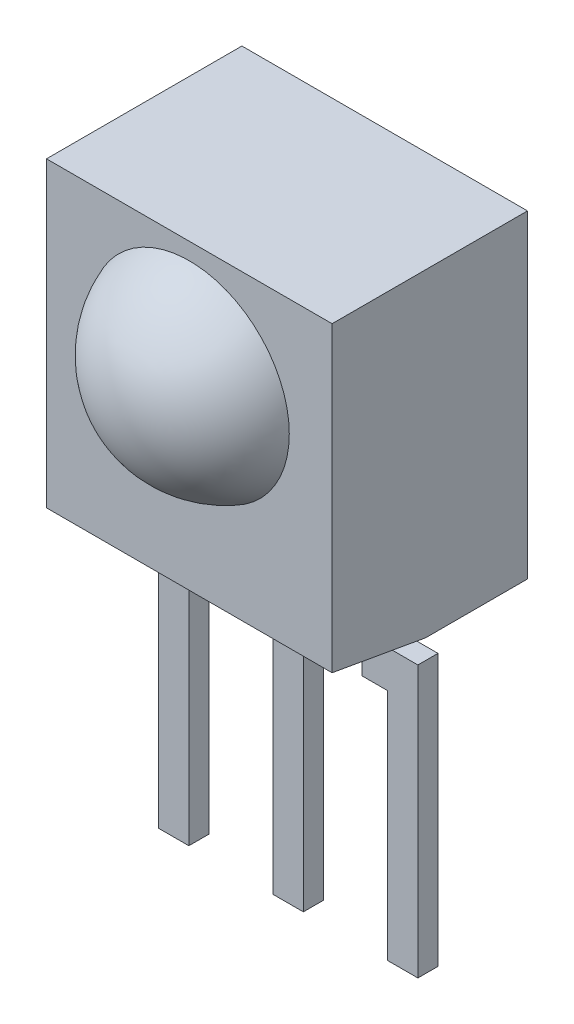
ISO-10303-21;
HEADER;
FILE_DESCRIPTION(('STEP AP214'),'2;1');
FILE_NAME('part.step','',(''),(''),'','','');
FILE_SCHEMA(('AUTOMOTIVE_DESIGN { 1 0 10303 214 1 1 1 1 }'));
ENDSEC;
DATA;
#1=APPLICATION_CONTEXT('core data for automotive mechanical design processes');
#2=APPLICATION_PROTOCOL_DEFINITION('international standard','automotive_design',2000,#1);
#3=PRODUCT_CONTEXT('',#1,'mechanical');
#4=PRODUCT('Part','Part','',(#3));
#5=PRODUCT_RELATED_PRODUCT_CATEGORY('part','',(#4));
#6=PRODUCT_DEFINITION_FORMATION('','',#4);
#7=PRODUCT_DEFINITION_CONTEXT('part definition',#1,'design');
#8=PRODUCT_DEFINITION('design','',#6,#7);
#9=PRODUCT_DEFINITION_SHAPE('','',#8);
#10=(LENGTH_UNIT() NAMED_UNIT(*) SI_UNIT(.MILLI.,.METRE.));
#11=(NAMED_UNIT(*) PLANE_ANGLE_UNIT() SI_UNIT($,.RADIAN.));
#12=(NAMED_UNIT(*) SI_UNIT($,.STERADIAN.) SOLID_ANGLE_UNIT());
#13=UNCERTAINTY_MEASURE_WITH_UNIT(LENGTH_MEASURE(1.E-05),#10,'distance_accuracy_value','');
#14=(GEOMETRIC_REPRESENTATION_CONTEXT(3) GLOBAL_UNCERTAINTY_ASSIGNED_CONTEXT((#13)) GLOBAL_UNIT_ASSIGNED_CONTEXT((#10,
#11,#12)) REPRESENTATION_CONTEXT('',''));
#15=CARTESIAN_POINT('',(0.,0.,0.));
#16=DIRECTION('',(0.,0.,1.));
#17=DIRECTION('',(1.,0.,0.));
#18=AXIS2_PLACEMENT_3D('',#15,#16,#17);
#19=CARTESIAN_POINT('',(-2.225,-4.91,1.635));
#20=DIRECTION('',(1.,0.,0.));
#21=DIRECTION('',(0.,1.,0.));
#22=AXIS2_PLACEMENT_3D('',#19,#20,#21);
#23=PLANE('',#22);
#24=DIRECTION('',(0.,0.,-1.));
#25=VECTOR('',#24,1.);
#26=CARTESIAN_POINT('',(-2.225,-4.11,1.635));
#27=LINE('',#26,#25);
#28=CARTESIAN_POINT('',(-2.225,-4.11,2.065));
#29=VERTEX_POINT('',#28);
#30=CARTESIAN_POINT('',(-2.225,-4.11,1.635));
#31=VERTEX_POINT('',#30);
#32=EDGE_CURVE('E282',#29,#31,#27,.T.);
#33=ORIENTED_EDGE('',*,*,#32,.F.);
#34=DIRECTION('',(0.,1.,0.));
#35=VECTOR('',#34,1.);
#36=CARTESIAN_POINT('',(-2.225,-4.91,2.065));
#37=LINE('',#36,#35);
#38=CARTESIAN_POINT('',(-2.225,-3.41,2.065));
#39=VERTEX_POINT('',#38);
#40=EDGE_CURVE('E304',#29,#39,#37,.T.);
#41=ORIENTED_EDGE('',*,*,#40,.T.);
#42=DIRECTION('',(0.,0.,-1.));
#43=VECTOR('',#42,1.);
#44=CARTESIAN_POINT('',(-2.225,-3.41,1.635));
#45=LINE('',#44,#43);
#46=CARTESIAN_POINT('',(-2.225,-3.41,1.635));
#47=VERTEX_POINT('',#46);
#48=EDGE_CURVE('E320',#39,#47,#45,.T.);
#49=ORIENTED_EDGE('',*,*,#48,.T.);
#50=DIRECTION('',(0.,1.,0.));
#51=VECTOR('',#50,1.);
#52=CARTESIAN_POINT('',(-2.225,-4.91,1.635));
#53=LINE('',#52,#51);
#54=EDGE_CURVE('E318',#31,#47,#53,.T.);
#55=ORIENTED_EDGE('',*,*,#54,.F.);
#56=EDGE_LOOP('',(#33,#41,#49,#55));
#57=FACE_BOUND('',#56,.T.);
#58=ADVANCED_FACE('F38',(#57),#23,.F.);
#59=CARTESIAN_POINT('',(3.055,-3.41,4.18));
#60=DIRECTION('',(0.,1.,0.));
#61=DIRECTION('',(-1.,0.,0.));
#62=AXIS2_PLACEMENT_3D('',#59,#60,#61);
#63=PLANE('',#62);
#64=DIRECTION('',(0.,0.,-1.));
#65=VECTOR('',#64,1.);
#66=CARTESIAN_POINT('',(1.575,-3.41,1.635));
#67=LINE('',#66,#65);
#68=CARTESIAN_POINT('',(1.575,-3.41,2.065));
#69=VERTEX_POINT('',#68);
#70=CARTESIAN_POINT('',(1.575,-3.41,1.635));
#71=VERTEX_POINT('',#70);
#72=EDGE_CURVE('E347',#69,#71,#67,.T.);
#73=ORIENTED_EDGE('',*,*,#72,.F.);
#74=DIRECTION('',(-1.,0.,0.));
#75=VECTOR('',#74,1.);
#76=CARTESIAN_POINT('',(2.225,-3.41,2.065));
#77=LINE('',#76,#75);
#78=CARTESIAN_POINT('',(2.225,-3.41,2.065));
#79=VERTEX_POINT('',#78);
#80=EDGE_CURVE('E323',#79,#69,#77,.T.);
#81=ORIENTED_EDGE('',*,*,#80,.F.);
#82=DIRECTION('',(0.,0.,1.));
#83=VECTOR('',#82,1.);
#84=CARTESIAN_POINT('',(2.225,-3.41,1.635));
#85=LINE('',#84,#83);
#86=CARTESIAN_POINT('',(2.225,-3.41,1.635));
#87=VERTEX_POINT('',#86);
#88=EDGE_CURVE('E336',#87,#79,#85,.T.);
#89=ORIENTED_EDGE('',*,*,#88,.F.);
#90=DIRECTION('',(1.,0.,0.));
#91=VECTOR('',#90,1.);
#92=CARTESIAN_POINT('',(2.225,-3.41,1.635));
#93=LINE('',#92,#91);
#94=EDGE_CURVE('E341',#71,#87,#93,.T.);
#95=ORIENTED_EDGE('',*,*,#94,.F.);
#96=EDGE_LOOP('',(#73,#81,#89,#95));
#97=FACE_BOUND('',#96,.T.);
#98=DIRECTION('',(0.,0.,-1.));
#99=VECTOR('',#98,1.);
#100=CARTESIAN_POINT('',(3.055,-3.41,4.18));
#101=LINE('',#100,#99);
#102=CARTESIAN_POINT('',(3.055,-3.41,2.17999999999996));
#103=VERTEX_POINT('',#102);
#104=CARTESIAN_POINT('',(3.055,-3.41,0.));
#105=VERTEX_POINT('',#104);
#106=EDGE_CURVE('E397',#103,#105,#101,.T.);
#107=ORIENTED_EDGE('',*,*,#106,.F.);
#108=DIRECTION('',(-1.,0.,0.));
#109=VECTOR('',#108,1.);
#110=CARTESIAN_POINT('',(-3.055,-3.41,2.17999999999996));
#111=LINE('',#110,#109);
#112=CARTESIAN_POINT('',(-3.055,-3.41,2.17999999999996));
#113=VERTEX_POINT('',#112);
#114=EDGE_CURVE('E47',#103,#113,#111,.T.);
#115=ORIENTED_EDGE('',*,*,#114,.T.);
#116=DIRECTION('',(0.,0.,-1.));
#117=VECTOR('',#116,1.);
#118=CARTESIAN_POINT('',(-3.055,-3.41,4.18));
#119=LINE('',#118,#117);
#120=CARTESIAN_POINT('',(-3.055,-3.41,0.));
#121=VERTEX_POINT('',#120);
#122=EDGE_CURVE('E399',#113,#121,#119,.T.);
#123=ORIENTED_EDGE('',*,*,#122,.T.);
#124=DIRECTION('',(1.,0.,0.));
#125=VECTOR('',#124,1.);
#126=CARTESIAN_POINT('',(3.055,-3.41,0.));
#127=LINE('',#126,#125);
#128=EDGE_CURVE('E386',#121,#105,#127,.T.);
#129=ORIENTED_EDGE('',*,*,#128,.T.);
#130=EDGE_LOOP('',(#107,#115,#123,#129));
#131=FACE_BOUND('',#130,.T.);
#132=DIRECTION('',(0.,0.,-1.));
#133=VECTOR('',#132,1.);
#134=CARTESIAN_POINT('',(-0.324999999999999,-3.41,1.635));
#135=LINE('',#134,#133);
#136=CARTESIAN_POINT('',(-0.324999999999999,-3.41,2.065));
#137=VERTEX_POINT('',#136);
#138=CARTESIAN_POINT('',(-0.324999999999998,-3.41,1.635));
#139=VERTEX_POINT('',#138);
#140=EDGE_CURVE('E350',#137,#139,#135,.T.);
#141=ORIENTED_EDGE('',*,*,#140,.F.);
#142=DIRECTION('',(-1.,0.,0.));
#143=VECTOR('',#142,1.);
#144=CARTESIAN_POINT('',(0.325000000000001,-3.41,2.065));
#145=LINE('',#144,#143);
#146=CARTESIAN_POINT('',(0.325000000000002,-3.41,2.065));
#147=VERTEX_POINT('',#146);
#148=EDGE_CURVE('E359',#147,#137,#145,.T.);
#149=ORIENTED_EDGE('',*,*,#148,.F.);
#150=DIRECTION('',(0.,0.,1.));
#151=VECTOR('',#150,1.);
#152=CARTESIAN_POINT('',(0.325000000000001,-3.41,1.635));
#153=LINE('',#152,#151);
#154=CARTESIAN_POINT('',(0.325000000000001,-3.41,1.635));
#155=VERTEX_POINT('',#154);
#156=EDGE_CURVE('E356',#155,#147,#153,.T.);
#157=ORIENTED_EDGE('',*,*,#156,.F.);
#158=DIRECTION('',(1.,0.,0.));
#159=VECTOR('',#158,1.);
#160=CARTESIAN_POINT('',(0.325000000000001,-3.41,1.635));
#161=LINE('',#160,#159);
#162=EDGE_CURVE('E353',#139,#155,#161,.T.);
#163=ORIENTED_EDGE('',*,*,#162,.F.);
#164=EDGE_LOOP('',(#141,#149,#157,#163));
#165=FACE_BOUND('',#164,.T.);
#166=ORIENTED_EDGE('',*,*,#48,.F.);
#167=DIRECTION('',(-1.,0.,0.));
#168=VECTOR('',#167,1.);
#169=CARTESIAN_POINT('',(-1.575,-3.41,2.065));
#170=LINE('',#169,#168);
#171=CARTESIAN_POINT('',(-1.575,-3.41,2.065));
#172=VERTEX_POINT('',#171);
#173=EDGE_CURVE('E295',#172,#39,#170,.T.);
#174=ORIENTED_EDGE('',*,*,#173,.F.);
#175=DIRECTION('',(0.,0.,1.));
#176=VECTOR('',#175,1.);
#177=CARTESIAN_POINT('',(-1.575,-3.41,1.635));
#178=LINE('',#177,#176);
#179=CARTESIAN_POINT('',(-1.575,-3.41,1.635));
#180=VERTEX_POINT('',#179);
#181=EDGE_CURVE('E309',#180,#172,#178,.T.);
#182=ORIENTED_EDGE('',*,*,#181,.F.);
#183=DIRECTION('',(1.,0.,0.));
#184=VECTOR('',#183,1.);
#185=CARTESIAN_POINT('',(-1.575,-3.41,1.635));
#186=LINE('',#185,#184);
#187=EDGE_CURVE('E315',#47,#180,#186,.T.);
#188=ORIENTED_EDGE('',*,*,#187,.F.);
#189=EDGE_LOOP('',(#166,#174,#182,#188));
#190=FACE_BOUND('',#189,.T.);
#191=ADVANCED_FACE('F431',(#97,#131,#165,#190),#63,.F.);
#192=CARTESIAN_POINT('',(-3.055,-3.41,4.18));
#193=DIRECTION('',(1.,0.,0.));
#194=DIRECTION('',(0.,0.,-1.));
#195=AXIS2_PLACEMENT_3D('',#192,#193,#194);
#196=PLANE('',#195);
#197=ORIENTED_EDGE('',*,*,#122,.F.);
#198=DIRECTION('',(0.,0.173648177666927,0.984807753012209));
#199=VECTOR('',#198,1.);
#200=CARTESIAN_POINT('',(-3.055,-3.05734603858307,4.18));
#201=LINE('',#200,#199);
#202=CARTESIAN_POINT('',(-3.055,-3.05734603858307,4.18));
#203=VERTEX_POINT('',#202);
#204=EDGE_CURVE('E11',#113,#203,#201,.T.);
#205=ORIENTED_EDGE('',*,*,#204,.T.);
#206=DIRECTION('',(0.,-1.,0.));
#207=VECTOR('',#206,1.);
#208=CARTESIAN_POINT('',(-3.055,-3.41,4.18));
#209=LINE('',#208,#207);
#210=CARTESIAN_POINT('',(-3.055,3.41,4.18));
#211=VERTEX_POINT('',#210);
#212=EDGE_CURVE('E375',#211,#203,#209,.T.);
#213=ORIENTED_EDGE('',*,*,#212,.F.);
#214=DIRECTION('',(0.,0.,-1.));
#215=VECTOR('',#214,1.);
#216=CARTESIAN_POINT('',(-3.055,3.41,4.18));
#217=LINE('',#216,#215);
#218=CARTESIAN_POINT('',(-3.055,3.41,0.));
#219=VERTEX_POINT('',#218);
#220=EDGE_CURVE('E383',#211,#219,#217,.T.);
#221=ORIENTED_EDGE('',*,*,#220,.T.);
#222=DIRECTION('',(0.,-1.,0.));
#223=VECTOR('',#222,1.);
#224=CARTESIAN_POINT('',(-3.055,-3.41,0.));
#225=LINE('',#224,#223);
#226=EDGE_CURVE('E374',#219,#121,#225,.T.);
#227=ORIENTED_EDGE('',*,*,#226,.T.);
#228=EDGE_LOOP('',(#197,#205,#213,#221,#227));
#229=FACE_BOUND('',#228,.T.);
#230=ADVANCED_FACE('F423',(#229),#196,.F.);
#231=CARTESIAN_POINT('',(3.055,-3.41,4.18));
#232=DIRECTION('',(-1.,0.,0.));
#233=DIRECTION('',(0.,0.,1.));
#234=AXIS2_PLACEMENT_3D('',#231,#232,#233);
#235=PLANE('',#234);
#236=DIRECTION('',(0.,1.,0.));
#237=VECTOR('',#236,1.);
#238=CARTESIAN_POINT('',(3.055,-3.41,4.18));
#239=LINE('',#238,#237);
#240=CARTESIAN_POINT('',(3.055,-3.05734603858307,4.18));
#241=VERTEX_POINT('',#240);
#242=CARTESIAN_POINT('',(3.055,3.41,4.18));
#243=VERTEX_POINT('',#242);
#244=EDGE_CURVE('E378',#241,#243,#239,.T.);
#245=ORIENTED_EDGE('',*,*,#244,.F.);
#246=DIRECTION('',(0.,-0.173648177666927,-0.984807753012209));
#247=VECTOR('',#246,1.);
#248=CARTESIAN_POINT('',(3.055,-3.05734603858307,4.18));
#249=LINE('',#248,#247);
#250=EDGE_CURVE('E61',#241,#103,#249,.T.);
#251=ORIENTED_EDGE('',*,*,#250,.T.);
#252=ORIENTED_EDGE('',*,*,#106,.T.);
#253=DIRECTION('',(0.,1.,0.));
#254=VECTOR('',#253,1.);
#255=CARTESIAN_POINT('',(3.055,-3.41,0.));
#256=LINE('',#255,#254);
#257=CARTESIAN_POINT('',(3.055,3.41,0.));
#258=VERTEX_POINT('',#257);
#259=EDGE_CURVE('E389',#105,#258,#256,.T.);
#260=ORIENTED_EDGE('',*,*,#259,.T.);
#261=DIRECTION('',(0.,0.,-1.));
#262=VECTOR('',#261,1.);
#263=CARTESIAN_POINT('',(3.055,3.41,4.18));
#264=LINE('',#263,#262);
#265=EDGE_CURVE('E394',#243,#258,#264,.T.);
#266=ORIENTED_EDGE('',*,*,#265,.F.);
#267=EDGE_LOOP('',(#245,#251,#252,#260,#266));
#268=FACE_BOUND('',#267,.T.);
#269=ADVANCED_FACE('F414',(#268),#235,.F.);
#270=CARTESIAN_POINT('',(3.055,3.41,4.18));
#271=DIRECTION('',(0.,-1.,0.));
#272=DIRECTION('',(1.,0.,0.));
#273=AXIS2_PLACEMENT_3D('',#270,#271,#272);
#274=PLANE('',#273);
#275=DIRECTION('',(-1.,0.,0.));
#276=VECTOR('',#275,1.);
#277=CARTESIAN_POINT('',(3.055,3.41,0.));
#278=LINE('',#277,#276);
#279=EDGE_CURVE('E379',#258,#219,#278,.T.);
#280=ORIENTED_EDGE('',*,*,#279,.T.);
#281=ORIENTED_EDGE('',*,*,#220,.F.);
#282=DIRECTION('',(-1.,0.,0.));
#283=VECTOR('',#282,1.);
#284=CARTESIAN_POINT('',(3.055,3.41,4.18));
#285=LINE('',#284,#283);
#286=EDGE_CURVE('E381',#243,#211,#285,.T.);
#287=ORIENTED_EDGE('',*,*,#286,.F.);
#288=ORIENTED_EDGE('',*,*,#265,.T.);
#289=EDGE_LOOP('',(#280,#281,#287,#288));
#290=FACE_BOUND('',#289,.T.);
#291=ADVANCED_FACE('F420',(#290),#274,.F.);
#292=CARTESIAN_POINT('',(0.,0.,4.18));
#293=DIRECTION('',(0.,0.,1.));
#294=DIRECTION('',(1.,0.,0.));
#295=AXIS2_PLACEMENT_3D('',#292,#293,#294);
#296=PLANE('',#295);
#297=CARTESIAN_POINT('',(0.,0.91,4.18));
#298=DIRECTION('',(0.,0.,1.));
#299=DIRECTION('',(1.,0.,0.));
#300=AXIS2_PLACEMENT_3D('',#297,#298,#299);
#301=CIRCLE('',#300,2.13892496362074);
#302=CARTESIAN_POINT('',(2.13892496362074,0.91,4.18));
#303=VERTEX_POINT('',#302);
#304=EDGE_CURVE('E401',#303,#303,#301,.T.);
#305=ORIENTED_EDGE('',*,*,#304,.F.);
#306=EDGE_LOOP('',(#305));
#307=FACE_BOUND('',#306,.T.);
#308=ORIENTED_EDGE('',*,*,#212,.T.);
#309=DIRECTION('',(1.,0.,0.));
#310=VECTOR('',#309,1.);
#311=CARTESIAN_POINT('',(3.055,-3.05734603858307,4.18));
#312=LINE('',#311,#310);
#313=EDGE_CURVE('E404',#203,#241,#312,.T.);
#314=ORIENTED_EDGE('',*,*,#313,.T.);
#315=ORIENTED_EDGE('',*,*,#244,.T.);
#316=ORIENTED_EDGE('',*,*,#286,.T.);
#317=EDGE_LOOP('',(#308,#314,#315,#316));
#318=FACE_BOUND('',#317,.T.);
#319=ADVANCED_FACE('F409',(#307,#318),#296,.T.);
#320=CARTESIAN_POINT('',(0.,0.,0.));
#321=DIRECTION('',(0.,0.,1.));
#322=DIRECTION('',(1.,0.,0.));
#323=AXIS2_PLACEMENT_3D('',#320,#321,#322);
#324=PLANE('',#323);
#325=ORIENTED_EDGE('',*,*,#226,.F.);
#326=ORIENTED_EDGE('',*,*,#279,.F.);
#327=ORIENTED_EDGE('',*,*,#259,.F.);
#328=ORIENTED_EDGE('',*,*,#128,.F.);
#329=EDGE_LOOP('',(#325,#326,#327,#328));
#330=FACE_BOUND('',#329,.T.);
#331=ADVANCED_FACE('F481',(#330),#324,.F.);
#332=CARTESIAN_POINT('',(0.,0.91,3.405));
#333=DIRECTION('',(0.,1.,0.));
#334=DIRECTION('',(0.,0.,-1.));
#335=AXIS2_PLACEMENT_3D('',#332,#333,#334);
#336=SPHERICAL_SURFACE('',#335,2.275);
#337=CARTESIAN_POINT('',(0.,0.91,3.405));
#338=DIRECTION('',(0.,0.,1.));
#339=DIRECTION('',(1.,0.,0.));
#340=AXIS2_PLACEMENT_3D('',#337,#338,#339);
#341=SPHERICAL_SURFACE('',#340,2.275);
#342=ORIENTED_EDGE('',*,*,#304,.T.);
#343=EDGE_LOOP('',(#342));
#344=FACE_BOUND('',#343,.T.);
#345=ADVANCED_FACE('F477',(#344),#341,.T.);
#346=CARTESIAN_POINT('',(-0.324999999999998,-4.91,1.635));
#347=DIRECTION('',(1.,0.,0.));
#348=DIRECTION('',(0.,1.,0.));
#349=AXIS2_PLACEMENT_3D('',#346,#347,#348);
#350=PLANE('',#349);
#351=ORIENTED_EDGE('',*,*,#140,.T.);
#352=DIRECTION('',(0.,1.,0.));
#353=VECTOR('',#352,1.);
#354=CARTESIAN_POINT('',(-0.324999999999998,-4.91,1.635));
#355=LINE('',#354,#353);
#356=CARTESIAN_POINT('',(-0.324999999999999,-9.91,1.635));
#357=VERTEX_POINT('',#356);
#358=EDGE_CURVE('E371',#357,#139,#355,.T.);
#359=ORIENTED_EDGE('',*,*,#358,.F.);
#360=DIRECTION('',(0.,0.,-1.));
#361=VECTOR('',#360,1.);
#362=CARTESIAN_POINT('',(-0.324999999999999,-9.91,1.635));
#363=LINE('',#362,#361);
#364=CARTESIAN_POINT('',(-0.324999999999999,-9.91,2.065));
#365=VERTEX_POINT('',#364);
#366=EDGE_CURVE('E267',#365,#357,#363,.T.);
#367=ORIENTED_EDGE('',*,*,#366,.F.);
#368=DIRECTION('',(0.,1.,0.));
#369=VECTOR('',#368,1.);
#370=CARTESIAN_POINT('',(-0.324999999999998,-4.91,2.065));
#371=LINE('',#370,#369);
#372=EDGE_CURVE('E362',#365,#137,#371,.T.);
#373=ORIENTED_EDGE('',*,*,#372,.T.);
#374=EDGE_LOOP('',(#351,#359,#367,#373));
#375=FACE_BOUND('',#374,.T.);
#376=ADVANCED_FACE('F473',(#375),#350,.F.);
#377=CARTESIAN_POINT('',(0.325000000000002,-4.91,1.635));
#378=DIRECTION('',(0.,0.,1.));
#379=DIRECTION('',(1.,0.,0.));
#380=AXIS2_PLACEMENT_3D('',#377,#378,#379);
#381=PLANE('',#380);
#382=ORIENTED_EDGE('',*,*,#162,.T.);
#383=DIRECTION('',(0.,1.,0.));
#384=VECTOR('',#383,1.);
#385=CARTESIAN_POINT('',(0.325000000000002,-4.91,1.635));
#386=LINE('',#385,#384);
#387=CARTESIAN_POINT('',(0.325000000000002,-9.91,1.635));
#388=VERTEX_POINT('',#387);
#389=EDGE_CURVE('E368',#388,#155,#386,.T.);
#390=ORIENTED_EDGE('',*,*,#389,.F.);
#391=DIRECTION('',(1.,0.,0.));
#392=VECTOR('',#391,1.);
#393=CARTESIAN_POINT('',(0.325000000000002,-9.91,1.635));
#394=LINE('',#393,#392);
#395=EDGE_CURVE('E270',#357,#388,#394,.T.);
#396=ORIENTED_EDGE('',*,*,#395,.F.);
#397=ORIENTED_EDGE('',*,*,#358,.T.);
#398=EDGE_LOOP('',(#382,#390,#396,#397));
#399=FACE_BOUND('',#398,.T.);
#400=ADVANCED_FACE('F469',(#399),#381,.F.);
#401=CARTESIAN_POINT('',(0.325000000000002,-4.91,1.635));
#402=DIRECTION('',(-1.,0.,0.));
#403=DIRECTION('',(0.,-1.,0.));
#404=AXIS2_PLACEMENT_3D('',#401,#402,#403);
#405=PLANE('',#404);
#406=ORIENTED_EDGE('',*,*,#156,.T.);
#407=DIRECTION('',(0.,1.,0.));
#408=VECTOR('',#407,1.);
#409=CARTESIAN_POINT('',(0.325000000000002,-4.91,2.065));
#410=LINE('',#409,#408);
#411=CARTESIAN_POINT('',(0.325000000000002,-9.91,2.065));
#412=VERTEX_POINT('',#411);
#413=EDGE_CURVE('E365',#412,#147,#410,.T.);
#414=ORIENTED_EDGE('',*,*,#413,.F.);
#415=DIRECTION('',(0.,0.,1.));
#416=VECTOR('',#415,1.);
#417=CARTESIAN_POINT('',(0.325000000000002,-9.91,1.635));
#418=LINE('',#417,#416);
#419=EDGE_CURVE('E261',#388,#412,#418,.T.);
#420=ORIENTED_EDGE('',*,*,#419,.F.);
#421=ORIENTED_EDGE('',*,*,#389,.T.);
#422=EDGE_LOOP('',(#406,#414,#420,#421));
#423=FACE_BOUND('',#422,.T.);
#424=ADVANCED_FACE('F465',(#423),#405,.F.);
#425=CARTESIAN_POINT('',(0.325000000000002,-4.91,2.065));
#426=DIRECTION('',(0.,0.,-1.));
#427=DIRECTION('',(-1.,0.,0.));
#428=AXIS2_PLACEMENT_3D('',#425,#426,#427);
#429=PLANE('',#428);
#430=ORIENTED_EDGE('',*,*,#148,.T.);
#431=ORIENTED_EDGE('',*,*,#372,.F.);
#432=DIRECTION('',(-1.,0.,0.));
#433=VECTOR('',#432,1.);
#434=CARTESIAN_POINT('',(0.325000000000002,-9.91,2.065));
#435=LINE('',#434,#433);
#436=EDGE_CURVE('E264',#412,#365,#435,.T.);
#437=ORIENTED_EDGE('',*,*,#436,.F.);
#438=ORIENTED_EDGE('',*,*,#413,.T.);
#439=EDGE_LOOP('',(#430,#431,#437,#438));
#440=FACE_BOUND('',#439,.T.);
#441=ADVANCED_FACE('F461',(#440),#429,.F.);
#442=CARTESIAN_POINT('',(1.575,-4.91,1.635));
#443=DIRECTION('',(1.,0.,0.));
#444=DIRECTION('',(0.,1.,0.));
#445=AXIS2_PLACEMENT_3D('',#442,#443,#444);
#446=PLANE('',#445);
#447=ORIENTED_EDGE('',*,*,#72,.T.);
#448=DIRECTION('',(0.,1.,0.));
#449=VECTOR('',#448,1.);
#450=CARTESIAN_POINT('',(1.575,-4.91,1.635));
#451=LINE('',#450,#449);
#452=CARTESIAN_POINT('',(1.575,-4.91,1.635));
#453=VERTEX_POINT('',#452);
#454=EDGE_CURVE('E344',#453,#71,#451,.T.);
#455=ORIENTED_EDGE('',*,*,#454,.F.);
#456=DIRECTION('',(0.,0.,-1.));
#457=VECTOR('',#456,1.);
#458=CARTESIAN_POINT('',(1.575,-4.91,1.635));
#459=LINE('',#458,#457);
#460=CARTESIAN_POINT('',(1.575,-4.91,2.065));
#461=VERTEX_POINT('',#460);
#462=EDGE_CURVE('E325',#461,#453,#459,.T.);
#463=ORIENTED_EDGE('',*,*,#462,.F.);
#464=DIRECTION('',(0.,1.,0.));
#465=VECTOR('',#464,1.);
#466=CARTESIAN_POINT('',(1.575,-4.91,2.065));
#467=LINE('',#466,#465);
#468=EDGE_CURVE('E331',#461,#69,#467,.T.);
#469=ORIENTED_EDGE('',*,*,#468,.T.);
#470=EDGE_LOOP('',(#447,#455,#463,#469));
#471=FACE_BOUND('',#470,.T.);
#472=ADVANCED_FACE('F457',(#471),#446,.F.);
#473=CARTESIAN_POINT('',(2.225,-4.91,1.635));
#474=DIRECTION('',(0.,0.,1.));
#475=DIRECTION('',(1.,0.,0.));
#476=AXIS2_PLACEMENT_3D('',#473,#474,#475);
#477=PLANE('',#476);
#478=ORIENTED_EDGE('',*,*,#94,.T.);
#479=DIRECTION('',(0.,1.,0.));
#480=VECTOR('',#479,1.);
#481=CARTESIAN_POINT('',(2.225,-4.91,1.635));
#482=LINE('',#481,#480);
#483=CARTESIAN_POINT('',(2.225,-4.11,1.635));
#484=VERTEX_POINT('',#483);
#485=EDGE_CURVE('E339',#484,#87,#482,.T.);
#486=ORIENTED_EDGE('',*,*,#485,.F.);
#487=DIRECTION('',(-1.,0.,0.));
#488=VECTOR('',#487,1.);
#489=CARTESIAN_POINT('',(2.775,-4.11,1.635));
#490=LINE('',#489,#488);
#491=CARTESIAN_POINT('',(2.775,-4.11,1.635));
#492=VERTEX_POINT('',#491);
#493=EDGE_CURVE('E280',#492,#484,#490,.T.);
#494=ORIENTED_EDGE('',*,*,#493,.F.);
#495=DIRECTION('',(0.,-1.,0.));
#496=VECTOR('',#495,1.);
#497=CARTESIAN_POINT('',(2.775,-4.91,1.635));
#498=LINE('',#497,#496);
#499=CARTESIAN_POINT('',(2.775,-9.91,1.635));
#500=VERTEX_POINT('',#499);
#501=EDGE_CURVE('E274',#492,#500,#498,.T.);
#502=ORIENTED_EDGE('',*,*,#501,.T.);
#503=DIRECTION('',(1.,0.,0.));
#504=VECTOR('',#503,1.);
#505=CARTESIAN_POINT('',(2.775,-9.91,1.635));
#506=LINE('',#505,#504);
#507=CARTESIAN_POINT('',(2.125,-9.91,1.635));
#508=VERTEX_POINT('',#507);
#509=EDGE_CURVE('E230',#508,#500,#506,.T.);
#510=ORIENTED_EDGE('',*,*,#509,.F.);
#511=DIRECTION('',(0.,1.,0.));
#512=VECTOR('',#511,1.);
#513=CARTESIAN_POINT('',(2.125,-9.91,1.635));
#514=LINE('',#513,#512);
#515=CARTESIAN_POINT('',(2.125,-4.91,1.635));
#516=VERTEX_POINT('',#515);
#517=EDGE_CURVE('E237',#508,#516,#514,.T.);
#518=ORIENTED_EDGE('',*,*,#517,.T.);
#519=DIRECTION('',(1.,0.,0.));
#520=VECTOR('',#519,1.);
#521=CARTESIAN_POINT('',(2.225,-4.91,1.635));
#522=LINE('',#521,#520);
#523=EDGE_CURVE('E327',#453,#516,#522,.T.);
#524=ORIENTED_EDGE('',*,*,#523,.F.);
#525=ORIENTED_EDGE('',*,*,#454,.T.);
#526=EDGE_LOOP('',(#478,#486,#494,#502,#510,#518,#524,#525));
#527=FACE_BOUND('',#526,.T.);
#528=ADVANCED_FACE('F453',(#527),#477,.F.);
#529=CARTESIAN_POINT('',(2.225,-4.91,1.635));
#530=DIRECTION('',(-1.,0.,0.));
#531=DIRECTION('',(0.,-1.,0.));
#532=AXIS2_PLACEMENT_3D('',#529,#530,#531);
#533=PLANE('',#532);
#534=DIRECTION('',(0.,1.,0.));
#535=VECTOR('',#534,1.);
#536=CARTESIAN_POINT('',(2.225,-4.91,2.065));
#537=LINE('',#536,#535);
#538=CARTESIAN_POINT('',(2.225,-4.11,2.065));
#539=VERTEX_POINT('',#538);
#540=EDGE_CURVE('E334',#539,#79,#537,.T.);
#541=ORIENTED_EDGE('',*,*,#540,.F.);
#542=DIRECTION('',(0.,0.,-1.));
#543=VECTOR('',#542,1.);
#544=CARTESIAN_POINT('',(2.225,-4.11,1.635));
#545=LINE('',#544,#543);
#546=EDGE_CURVE('E273',#539,#484,#545,.T.);
#547=ORIENTED_EDGE('',*,*,#546,.T.);
#548=ORIENTED_EDGE('',*,*,#485,.T.);
#549=ORIENTED_EDGE('',*,*,#88,.T.);
#550=EDGE_LOOP('',(#541,#547,#548,#549));
#551=FACE_BOUND('',#550,.T.);
#552=ADVANCED_FACE('F450',(#551),#533,.F.);
#553=CARTESIAN_POINT('',(2.225,-4.91,2.065));
#554=DIRECTION('',(0.,0.,-1.));
#555=DIRECTION('',(-1.,0.,0.));
#556=AXIS2_PLACEMENT_3D('',#553,#554,#555);
#557=PLANE('',#556);
#558=ORIENTED_EDGE('',*,*,#80,.T.);
#559=ORIENTED_EDGE('',*,*,#468,.F.);
#560=DIRECTION('',(-1.,0.,0.));
#561=VECTOR('',#560,1.);
#562=CARTESIAN_POINT('',(2.225,-4.91,2.065));
#563=LINE('',#562,#561);
#564=CARTESIAN_POINT('',(2.125,-4.91,2.065));
#565=VERTEX_POINT('',#564);
#566=EDGE_CURVE('E329',#565,#461,#563,.T.);
#567=ORIENTED_EDGE('',*,*,#566,.F.);
#568=DIRECTION('',(0.,1.,0.));
#569=VECTOR('',#568,1.);
#570=CARTESIAN_POINT('',(2.125,-9.91,2.065));
#571=LINE('',#570,#569);
#572=CARTESIAN_POINT('',(2.125,-9.91,2.065));
#573=VERTEX_POINT('',#572);
#574=EDGE_CURVE('E222',#573,#565,#571,.T.);
#575=ORIENTED_EDGE('',*,*,#574,.F.);
#576=DIRECTION('',(-1.,0.,0.));
#577=VECTOR('',#576,1.);
#578=CARTESIAN_POINT('',(2.775,-9.91,2.065));
#579=LINE('',#578,#577);
#580=CARTESIAN_POINT('',(2.775,-9.91,2.065));
#581=VERTEX_POINT('',#580);
#582=EDGE_CURVE('E217',#581,#573,#579,.T.);
#583=ORIENTED_EDGE('',*,*,#582,.F.);
#584=DIRECTION('',(0.,1.,0.));
#585=VECTOR('',#584,1.);
#586=CARTESIAN_POINT('',(2.775,-4.91,2.065));
#587=LINE('',#586,#585);
#588=CARTESIAN_POINT('',(2.775,-4.11,2.065));
#589=VERTEX_POINT('',#588);
#590=EDGE_CURVE('E205',#581,#589,#587,.T.);
#591=ORIENTED_EDGE('',*,*,#590,.T.);
#592=DIRECTION('',(-1.,0.,0.));
#593=VECTOR('',#592,1.);
#594=CARTESIAN_POINT('',(2.775,-4.11,2.065));
#595=LINE('',#594,#593);
#596=EDGE_CURVE('E214',#589,#539,#595,.T.);
#597=ORIENTED_EDGE('',*,*,#596,.T.);
#598=ORIENTED_EDGE('',*,*,#540,.T.);
#599=EDGE_LOOP('',(#558,#559,#567,#575,#583,#591,#597,#598));
#600=FACE_BOUND('',#599,.T.);
#601=ADVANCED_FACE('F219',(#600),#557,.F.);
#602=CARTESIAN_POINT('',(1.9,-4.91,0.));
#603=DIRECTION('',(0.,-1.,0.));
#604=DIRECTION('',(0.,0.,-1.));
#605=AXIS2_PLACEMENT_3D('',#602,#603,#604);
#606=PLANE('',#605);
#607=DIRECTION('',(0.,0.,-1.));
#608=VECTOR('',#607,1.);
#609=CARTESIAN_POINT('',(2.125,-4.91,1.635));
#610=LINE('',#609,#608);
#611=EDGE_CURVE('E231',#565,#516,#610,.T.);
#612=ORIENTED_EDGE('',*,*,#611,.F.);
#613=ORIENTED_EDGE('',*,*,#566,.T.);
#614=ORIENTED_EDGE('',*,*,#462,.T.);
#615=ORIENTED_EDGE('',*,*,#523,.T.);
#616=EDGE_LOOP('',(#612,#613,#614,#615));
#617=FACE_BOUND('',#616,.T.);
#618=ADVANCED_FACE('F444',(#617),#606,.T.);
#619=CARTESIAN_POINT('',(-1.575,-4.91,1.635));
#620=DIRECTION('',(0.,0.,1.));
#621=DIRECTION('',(1.,0.,0.));
#622=AXIS2_PLACEMENT_3D('',#619,#620,#621);
#623=PLANE('',#622);
#624=ORIENTED_EDGE('',*,*,#187,.T.);
#625=DIRECTION('',(0.,1.,0.));
#626=VECTOR('',#625,1.);
#627=CARTESIAN_POINT('',(-1.575,-4.91,1.635));
#628=LINE('',#627,#626);
#629=CARTESIAN_POINT('',(-1.575,-4.91,1.635));
#630=VERTEX_POINT('',#629);
#631=EDGE_CURVE('E312',#630,#180,#628,.T.);
#632=ORIENTED_EDGE('',*,*,#631,.F.);
#633=DIRECTION('',(1.,0.,0.));
#634=VECTOR('',#633,1.);
#635=CARTESIAN_POINT('',(-1.575,-4.91,1.635));
#636=LINE('',#635,#634);
#637=CARTESIAN_POINT('',(-2.125,-4.91,1.635));
#638=VERTEX_POINT('',#637);
#639=EDGE_CURVE('E298',#638,#630,#636,.T.);
#640=ORIENTED_EDGE('',*,*,#639,.F.);
#641=DIRECTION('',(0.,1.,0.));
#642=VECTOR('',#641,1.);
#643=CARTESIAN_POINT('',(-2.125,-9.91,1.635));
#644=LINE('',#643,#642);
#645=CARTESIAN_POINT('',(-2.125,-9.91,1.635));
#646=VERTEX_POINT('',#645);
#647=EDGE_CURVE('E258',#646,#638,#644,.T.);
#648=ORIENTED_EDGE('',*,*,#647,.F.);
#649=DIRECTION('',(1.,0.,0.));
#650=VECTOR('',#649,1.);
#651=CARTESIAN_POINT('',(-2.775,-9.91,1.635));
#652=LINE('',#651,#650);
#653=CARTESIAN_POINT('',(-2.775,-9.91,1.635));
#654=VERTEX_POINT('',#653);
#655=EDGE_CURVE('E246',#654,#646,#652,.T.);
#656=ORIENTED_EDGE('',*,*,#655,.F.);
#657=DIRECTION('',(0.,-1.,0.));
#658=VECTOR('',#657,1.);
#659=CARTESIAN_POINT('',(-2.775,-4.91,1.635));
#660=LINE('',#659,#658);
#661=CARTESIAN_POINT('',(-2.775,-4.11,1.635));
#662=VERTEX_POINT('',#661);
#663=EDGE_CURVE('E283',#662,#654,#660,.T.);
#664=ORIENTED_EDGE('',*,*,#663,.F.);
#665=DIRECTION('',(1.,0.,0.));
#666=VECTOR('',#665,1.);
#667=CARTESIAN_POINT('',(-2.775,-4.11,1.635));
#668=LINE('',#667,#666);
#669=EDGE_CURVE('E289',#662,#31,#668,.T.);
#670=ORIENTED_EDGE('',*,*,#669,.T.);
#671=ORIENTED_EDGE('',*,*,#54,.T.);
#672=EDGE_LOOP('',(#624,#632,#640,#648,#656,#664,#670,#671));
#673=FACE_BOUND('',#672,.T.);
#674=ADVANCED_FACE('F442',(#673),#623,.F.);
#675=CARTESIAN_POINT('',(-1.575,-4.91,1.635));
#676=DIRECTION('',(-1.,0.,0.));
#677=DIRECTION('',(0.,-1.,0.));
#678=AXIS2_PLACEMENT_3D('',#675,#676,#677);
#679=PLANE('',#678);
#680=ORIENTED_EDGE('',*,*,#181,.T.);
#681=DIRECTION('',(0.,1.,0.));
#682=VECTOR('',#681,1.);
#683=CARTESIAN_POINT('',(-1.575,-4.91,2.065));
#684=LINE('',#683,#682);
#685=CARTESIAN_POINT('',(-1.575,-4.91,2.065));
#686=VERTEX_POINT('',#685);
#687=EDGE_CURVE('E306',#686,#172,#684,.T.);
#688=ORIENTED_EDGE('',*,*,#687,.F.);
#689=DIRECTION('',(0.,0.,1.));
#690=VECTOR('',#689,1.);
#691=CARTESIAN_POINT('',(-1.575,-4.91,1.635));
#692=LINE('',#691,#690);
#693=EDGE_CURVE('E300',#630,#686,#692,.T.);
#694=ORIENTED_EDGE('',*,*,#693,.F.);
#695=ORIENTED_EDGE('',*,*,#631,.T.);
#696=EDGE_LOOP('',(#680,#688,#694,#695));
#697=FACE_BOUND('',#696,.T.);
#698=ADVANCED_FACE('F561',(#697),#679,.F.);
#699=CARTESIAN_POINT('',(-1.575,-4.91,2.065));
#700=DIRECTION('',(0.,0.,-1.));
#701=DIRECTION('',(-1.,0.,0.));
#702=AXIS2_PLACEMENT_3D('',#699,#700,#701);
#703=PLANE('',#702);
#704=ORIENTED_EDGE('',*,*,#173,.T.);
#705=ORIENTED_EDGE('',*,*,#40,.F.);
#706=DIRECTION('',(1.,0.,0.));
#707=VECTOR('',#706,1.);
#708=CARTESIAN_POINT('',(-2.775,-4.11,2.065));
#709=LINE('',#708,#707);
#710=CARTESIAN_POINT('',(-2.775,-4.11,2.065));
#711=VERTEX_POINT('',#710);
#712=EDGE_CURVE('E293',#711,#29,#709,.T.);
#713=ORIENTED_EDGE('',*,*,#712,.F.);
#714=DIRECTION('',(0.,1.,0.));
#715=VECTOR('',#714,1.);
#716=CARTESIAN_POINT('',(-2.775,-4.91,2.065));
#717=LINE('',#716,#715);
#718=CARTESIAN_POINT('',(-2.775,-9.91,2.065));
#719=VERTEX_POINT('',#718);
#720=EDGE_CURVE('E285',#719,#711,#717,.T.);
#721=ORIENTED_EDGE('',*,*,#720,.F.);
#722=DIRECTION('',(-1.,0.,0.));
#723=VECTOR('',#722,1.);
#724=CARTESIAN_POINT('',(-2.775,-9.91,2.065));
#725=LINE('',#724,#723);
#726=CARTESIAN_POINT('',(-2.125,-9.91,2.065));
#727=VERTEX_POINT('',#726);
#728=EDGE_CURVE('E250',#727,#719,#725,.T.);
#729=ORIENTED_EDGE('',*,*,#728,.F.);
#730=DIRECTION('',(0.,1.,0.));
#731=VECTOR('',#730,1.);
#732=CARTESIAN_POINT('',(-2.125,-9.91,2.065));
#733=LINE('',#732,#731);
#734=CARTESIAN_POINT('',(-2.125,-4.91,2.065));
#735=VERTEX_POINT('',#734);
#736=EDGE_CURVE('E253',#727,#735,#733,.T.);
#737=ORIENTED_EDGE('',*,*,#736,.T.);
#738=DIRECTION('',(-1.,0.,0.));
#739=VECTOR('',#738,1.);
#740=CARTESIAN_POINT('',(-1.575,-4.91,2.065));
#741=LINE('',#740,#739);
#742=EDGE_CURVE('E302',#686,#735,#741,.T.);
#743=ORIENTED_EDGE('',*,*,#742,.F.);
#744=ORIENTED_EDGE('',*,*,#687,.T.);
#745=EDGE_LOOP('',(#704,#705,#713,#721,#729,#737,#743,#744));
#746=FACE_BOUND('',#745,.T.);
#747=ADVANCED_FACE('F569',(#746),#703,.F.);
#748=CARTESIAN_POINT('',(-1.9,-4.91,0.));
#749=DIRECTION('',(0.,-1.,0.));
#750=DIRECTION('',(0.,0.,-1.));
#751=AXIS2_PLACEMENT_3D('',#748,#749,#750);
#752=PLANE('',#751);
#753=DIRECTION('',(0.,0.,1.));
#754=VECTOR('',#753,1.);
#755=CARTESIAN_POINT('',(-2.125,-4.91,1.635));
#756=LINE('',#755,#754);
#757=EDGE_CURVE('E242',#638,#735,#756,.T.);
#758=ORIENTED_EDGE('',*,*,#757,.F.);
#759=ORIENTED_EDGE('',*,*,#639,.T.);
#760=ORIENTED_EDGE('',*,*,#693,.T.);
#761=ORIENTED_EDGE('',*,*,#742,.T.);
#762=EDGE_LOOP('',(#758,#759,#760,#761));
#763=FACE_BOUND('',#762,.T.);
#764=ADVANCED_FACE('F576',(#763),#752,.T.);
#765=CARTESIAN_POINT('',(-2.775,-4.11,1.635));
#766=DIRECTION('',(0.,-1.,0.));
#767=DIRECTION('',(1.,0.,0.));
#768=AXIS2_PLACEMENT_3D('',#765,#766,#767);
#769=PLANE('',#768);
#770=ORIENTED_EDGE('',*,*,#32,.T.);
#771=ORIENTED_EDGE('',*,*,#669,.F.);
#772=DIRECTION('',(0.,0.,-1.));
#773=VECTOR('',#772,1.);
#774=CARTESIAN_POINT('',(-2.775,-4.11,1.635));
#775=LINE('',#774,#773);
#776=EDGE_CURVE('E287',#711,#662,#775,.T.);
#777=ORIENTED_EDGE('',*,*,#776,.F.);
#778=ORIENTED_EDGE('',*,*,#712,.T.);
#779=EDGE_LOOP('',(#770,#771,#777,#778));
#780=FACE_BOUND('',#779,.T.);
#781=ADVANCED_FACE('F583',(#780),#769,.F.);
#782=CARTESIAN_POINT('',(-2.775,0.,0.));
#783=DIRECTION('',(1.,0.,0.));
#784=DIRECTION('',(0.,1.,0.));
#785=AXIS2_PLACEMENT_3D('',#782,#783,#784);
#786=PLANE('',#785);
#787=ORIENTED_EDGE('',*,*,#663,.T.);
#788=DIRECTION('',(0.,0.,-1.));
#789=VECTOR('',#788,1.);
#790=CARTESIAN_POINT('',(-2.775,-9.91,1.635));
#791=LINE('',#790,#789);
#792=EDGE_CURVE('E243',#719,#654,#791,.T.);
#793=ORIENTED_EDGE('',*,*,#792,.F.);
#794=ORIENTED_EDGE('',*,*,#720,.T.);
#795=ORIENTED_EDGE('',*,*,#776,.T.);
#796=EDGE_LOOP('',(#787,#793,#794,#795));
#797=FACE_BOUND('',#796,.T.);
#798=ADVANCED_FACE('F591',(#797),#786,.F.);
#799=CARTESIAN_POINT('',(2.775,-4.11,1.635));
#800=DIRECTION('',(0.,1.,0.));
#801=DIRECTION('',(-1.,0.,0.));
#802=AXIS2_PLACEMENT_3D('',#799,#800,#801);
#803=PLANE('',#802);
#804=ORIENTED_EDGE('',*,*,#546,.F.);
#805=ORIENTED_EDGE('',*,*,#596,.F.);
#806=DIRECTION('',(0.,0.,-1.));
#807=VECTOR('',#806,1.);
#808=CARTESIAN_POINT('',(2.775,-4.11,1.635));
#809=LINE('',#808,#807);
#810=EDGE_CURVE('E212',#589,#492,#809,.T.);
#811=ORIENTED_EDGE('',*,*,#810,.T.);
#812=ORIENTED_EDGE('',*,*,#493,.T.);
#813=EDGE_LOOP('',(#804,#805,#811,#812));
#814=FACE_BOUND('',#813,.T.);
#815=ADVANCED_FACE('F600',(#814),#803,.T.);
#816=CARTESIAN_POINT('',(2.775,0.,0.));
#817=DIRECTION('',(-1.,0.,0.));
#818=DIRECTION('',(0.,1.,0.));
#819=AXIS2_PLACEMENT_3D('',#816,#817,#818);
#820=PLANE('',#819);
#821=ORIENTED_EDGE('',*,*,#501,.F.);
#822=ORIENTED_EDGE('',*,*,#810,.F.);
#823=ORIENTED_EDGE('',*,*,#590,.F.);
#824=DIRECTION('',(0.,0.,1.));
#825=VECTOR('',#824,1.);
#826=CARTESIAN_POINT('',(2.775,-9.91,1.635));
#827=LINE('',#826,#825);
#828=EDGE_CURVE('E210',#500,#581,#827,.T.);
#829=ORIENTED_EDGE('',*,*,#828,.F.);
#830=EDGE_LOOP('',(#821,#822,#823,#829));
#831=FACE_BOUND('',#830,.T.);
#832=ADVANCED_FACE('F208',(#831),#820,.F.);
#833=CARTESIAN_POINT('',(0.,-9.91,0.));
#834=DIRECTION('',(0.,-1.,0.));
#835=DIRECTION('',(0.,0.,-1.));
#836=AXIS2_PLACEMENT_3D('',#833,#834,#835);
#837=PLANE('',#836);
#838=ORIENTED_EDGE('',*,*,#419,.T.);
#839=ORIENTED_EDGE('',*,*,#436,.T.);
#840=ORIENTED_EDGE('',*,*,#366,.T.);
#841=ORIENTED_EDGE('',*,*,#395,.T.);
#842=EDGE_LOOP('',(#838,#839,#840,#841));
#843=FACE_BOUND('',#842,.T.);
#844=ADVANCED_FACE('F614',(#843),#837,.T.);
#845=CARTESIAN_POINT('',(-2.125,-9.91,1.635));
#846=DIRECTION('',(-1.,0.,0.));
#847=DIRECTION('',(0.,0.,1.));
#848=AXIS2_PLACEMENT_3D('',#845,#846,#847);
#849=PLANE('',#848);
#850=ORIENTED_EDGE('',*,*,#757,.T.);
#851=ORIENTED_EDGE('',*,*,#736,.F.);
#852=DIRECTION('',(0.,0.,1.));
#853=VECTOR('',#852,1.);
#854=CARTESIAN_POINT('',(-2.125,-9.91,1.635));
#855=LINE('',#854,#853);
#856=EDGE_CURVE('E248',#646,#727,#855,.T.);
#857=ORIENTED_EDGE('',*,*,#856,.F.);
#858=ORIENTED_EDGE('',*,*,#647,.T.);
#859=EDGE_LOOP('',(#850,#851,#857,#858));
#860=FACE_BOUND('',#859,.T.);
#861=ADVANCED_FACE('F621',(#860),#849,.F.);
#862=CARTESIAN_POINT('',(0.,-9.91,0.));
#863=DIRECTION('',(0.,1.,0.));
#864=DIRECTION('',(0.,0.,1.));
#865=AXIS2_PLACEMENT_3D('',#862,#863,#864);
#866=PLANE('',#865);
#867=ORIENTED_EDGE('',*,*,#792,.T.);
#868=ORIENTED_EDGE('',*,*,#655,.T.);
#869=ORIENTED_EDGE('',*,*,#856,.T.);
#870=ORIENTED_EDGE('',*,*,#728,.T.);
#871=EDGE_LOOP('',(#867,#868,#869,#870));
#872=FACE_BOUND('',#871,.T.);
#873=ADVANCED_FACE('F629',(#872),#866,.F.);
#874=CARTESIAN_POINT('',(2.125,-9.91,1.635));
#875=DIRECTION('',(1.,0.,0.));
#876=DIRECTION('',(0.,0.,-1.));
#877=AXIS2_PLACEMENT_3D('',#874,#875,#876);
#878=PLANE('',#877);
#879=ORIENTED_EDGE('',*,*,#611,.T.);
#880=ORIENTED_EDGE('',*,*,#517,.F.);
#881=DIRECTION('',(0.,0.,-1.));
#882=VECTOR('',#881,1.);
#883=CARTESIAN_POINT('',(2.125,-9.91,1.635));
#884=LINE('',#883,#882);
#885=EDGE_CURVE('E225',#573,#508,#884,.T.);
#886=ORIENTED_EDGE('',*,*,#885,.F.);
#887=ORIENTED_EDGE('',*,*,#574,.T.);
#888=EDGE_LOOP('',(#879,#880,#886,#887));
#889=FACE_BOUND('',#888,.T.);
#890=ADVANCED_FACE('F428',(#889),#878,.F.);
#891=CARTESIAN_POINT('',(0.,-9.91,0.));
#892=DIRECTION('',(0.,-1.,0.));
#893=DIRECTION('',(0.,0.,-1.));
#894=AXIS2_PLACEMENT_3D('',#891,#892,#893);
#895=PLANE('',#894);
#896=ORIENTED_EDGE('',*,*,#828,.T.);
#897=ORIENTED_EDGE('',*,*,#582,.T.);
#898=ORIENTED_EDGE('',*,*,#885,.T.);
#899=ORIENTED_EDGE('',*,*,#509,.T.);
#900=EDGE_LOOP('',(#896,#897,#898,#899));
#901=FACE_BOUND('',#900,.T.);
#902=ADVANCED_FACE('F228',(#901),#895,.T.);
#903=CARTESIAN_POINT('',(0.,-3.05734603858307,4.18));
#904=DIRECTION('',(0.,-0.984807753012209,0.173648177666927));
#905=DIRECTION('',(-1.,0.,0.));
#906=AXIS2_PLACEMENT_3D('',#903,#904,#905);
#907=PLANE('',#906);
#908=ORIENTED_EDGE('',*,*,#204,.F.);
#909=ORIENTED_EDGE('',*,*,#114,.F.);
#910=ORIENTED_EDGE('',*,*,#250,.F.);
#911=ORIENTED_EDGE('',*,*,#313,.F.);
#912=EDGE_LOOP('',(#908,#909,#910,#911));
#913=FACE_BOUND('',#912,.T.);
#914=ADVANCED_FACE('F41',(#913),#907,.T.);
#915=CLOSED_SHELL('',(#58,#191,#230,#269,#291,#319,#331,#345,#376,#400,#424,#441,#472,#528,#552,
#601,#618,#674,#698,#747,#764,#781,#798,#815,#832,#844,#861,#873,#890,#902,#914));
#916=MANIFOLD_SOLID_BREP('B2',#915);
#917=ADVANCED_BREP_SHAPE_REPRESENTATION('',(#18,#916),#14);
#918=SHAPE_DEFINITION_REPRESENTATION(#9,#917);
ENDSEC;
END-ISO-10303-21;
